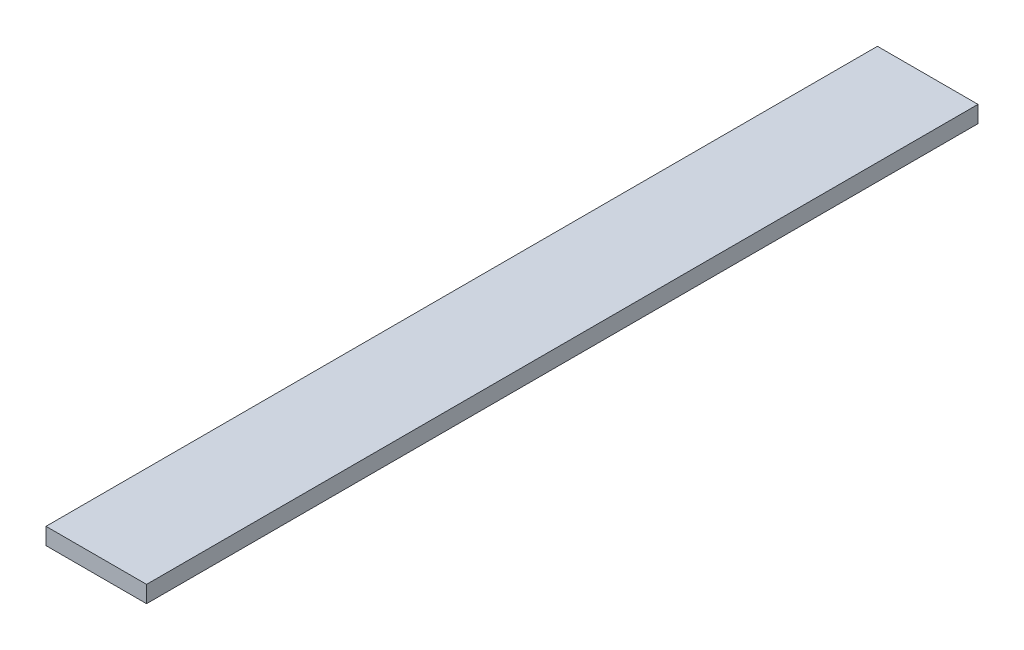
ISO-10303-21;
HEADER;
FILE_DESCRIPTION(('STEP AP214'),'2;1');
FILE_NAME('part.step','',(''),(''),'','','');
FILE_SCHEMA(('AUTOMOTIVE_DESIGN { 1 0 10303 214 1 1 1 1 }'));
ENDSEC;
DATA;
#1=APPLICATION_CONTEXT('core data for automotive mechanical design processes');
#2=APPLICATION_PROTOCOL_DEFINITION('international standard','automotive_design',2000,#1);
#3=PRODUCT_CONTEXT('',#1,'mechanical');
#4=PRODUCT('Part','Part','',(#3));
#5=PRODUCT_RELATED_PRODUCT_CATEGORY('part','',(#4));
#6=PRODUCT_DEFINITION_FORMATION('','',#4);
#7=PRODUCT_DEFINITION_CONTEXT('part definition',#1,'design');
#8=PRODUCT_DEFINITION('design','',#6,#7);
#9=PRODUCT_DEFINITION_SHAPE('','',#8);
#10=(LENGTH_UNIT() NAMED_UNIT(*) SI_UNIT(.MILLI.,.METRE.));
#11=(NAMED_UNIT(*) PLANE_ANGLE_UNIT() SI_UNIT($,.RADIAN.));
#12=(NAMED_UNIT(*) SI_UNIT($,.STERADIAN.) SOLID_ANGLE_UNIT());
#13=UNCERTAINTY_MEASURE_WITH_UNIT(LENGTH_MEASURE(1.E-05),#10,'distance_accuracy_value','');
#14=(GEOMETRIC_REPRESENTATION_CONTEXT(3) GLOBAL_UNCERTAINTY_ASSIGNED_CONTEXT((#13)) GLOBAL_UNIT_ASSIGNED_CONTEXT((#10,
#11,#12)) REPRESENTATION_CONTEXT('',''));
#15=CARTESIAN_POINT('',(0.,0.,0.));
#16=DIRECTION('',(0.,0.,1.));
#17=DIRECTION('',(1.,0.,0.));
#18=AXIS2_PLACEMENT_3D('',#15,#16,#17);
#19=CARTESIAN_POINT('',(-38.1,-6.35,630.));
#20=DIRECTION('',(1.,0.,0.));
#21=DIRECTION('',(0.,0.,-1.));
#22=AXIS2_PLACEMENT_3D('',#19,#20,#21);
#23=PLANE('',#22);
#24=DIRECTION('',(0.,-1.,0.));
#25=VECTOR('',#24,1.);
#26=CARTESIAN_POINT('',(-38.1,-6.35,0.));
#27=LINE('',#26,#25);
#28=CARTESIAN_POINT('',(-38.1,6.35,0.));
#29=VERTEX_POINT('',#28);
#30=CARTESIAN_POINT('',(-38.1,-6.35,0.));
#31=VERTEX_POINT('',#30);
#32=EDGE_CURVE('E96',#29,#31,#27,.T.);
#33=ORIENTED_EDGE('',*,*,#32,.T.);
#34=DIRECTION('',(0.,0.,-1.));
#35=VECTOR('',#34,1.);
#36=CARTESIAN_POINT('',(-38.1,-6.35,630.));
#37=LINE('',#36,#35);
#38=CARTESIAN_POINT('',(-38.1,-6.35,630.));
#39=VERTEX_POINT('',#38);
#40=EDGE_CURVE('E11',#39,#31,#37,.T.);
#41=ORIENTED_EDGE('',*,*,#40,.F.);
#42=DIRECTION('',(0.,-1.,0.));
#43=VECTOR('',#42,1.);
#44=CARTESIAN_POINT('',(-38.1,-6.35,630.));
#45=LINE('',#44,#43);
#46=CARTESIAN_POINT('',(-38.1,6.35,630.));
#47=VERTEX_POINT('',#46);
#48=EDGE_CURVE('E84',#47,#39,#45,.T.);
#49=ORIENTED_EDGE('',*,*,#48,.F.);
#50=DIRECTION('',(0.,0.,-1.));
#51=VECTOR('',#50,1.);
#52=CARTESIAN_POINT('',(-38.1,6.35,630.));
#53=LINE('',#52,#51);
#54=EDGE_CURVE('E92',#47,#29,#53,.T.);
#55=ORIENTED_EDGE('',*,*,#54,.T.);
#56=EDGE_LOOP('',(#33,#41,#49,#55));
#57=FACE_BOUND('',#56,.T.);
#58=ADVANCED_FACE('F33',(#57),#23,.F.);
#59=CARTESIAN_POINT('',(38.1,-6.35,630.));
#60=DIRECTION('',(0.,1.,0.));
#61=DIRECTION('',(0.,0.,1.));
#62=AXIS2_PLACEMENT_3D('',#59,#60,#61);
#63=PLANE('',#62);
#64=DIRECTION('',(1.,0.,0.));
#65=VECTOR('',#64,1.);
#66=CARTESIAN_POINT('',(38.1,-6.35,0.));
#67=LINE('',#66,#65);
#68=CARTESIAN_POINT('',(38.1,-6.35,0.));
#69=VERTEX_POINT('',#68);
#70=EDGE_CURVE('E88',#31,#69,#67,.T.);
#71=ORIENTED_EDGE('',*,*,#70,.T.);
#72=DIRECTION('',(0.,0.,-1.));
#73=VECTOR('',#72,1.);
#74=CARTESIAN_POINT('',(38.1,-6.35,630.));
#75=LINE('',#74,#73);
#76=CARTESIAN_POINT('',(38.1,-6.35,630.));
#77=VERTEX_POINT('',#76);
#78=EDGE_CURVE('E41',#77,#69,#75,.T.);
#79=ORIENTED_EDGE('',*,*,#78,.F.);
#80=DIRECTION('',(1.,0.,0.));
#81=VECTOR('',#80,1.);
#82=CARTESIAN_POINT('',(38.1,-6.35,630.));
#83=LINE('',#82,#81);
#84=EDGE_CURVE('E79',#39,#77,#83,.T.);
#85=ORIENTED_EDGE('',*,*,#84,.F.);
#86=ORIENTED_EDGE('',*,*,#40,.T.);
#87=EDGE_LOOP('',(#71,#79,#85,#86));
#88=FACE_BOUND('',#87,.T.);
#89=ADVANCED_FACE('F87',(#88),#63,.F.);
#90=CARTESIAN_POINT('',(38.1,-6.35,630.));
#91=DIRECTION('',(-1.,0.,0.));
#92=DIRECTION('',(0.,-1.,0.));
#93=AXIS2_PLACEMENT_3D('',#90,#91,#92);
#94=PLANE('',#93);
#95=DIRECTION('',(0.,1.,0.));
#96=VECTOR('',#95,1.);
#97=CARTESIAN_POINT('',(38.1,-6.35,0.));
#98=LINE('',#97,#96);
#99=CARTESIAN_POINT('',(38.1,6.35,0.));
#100=VERTEX_POINT('',#99);
#101=EDGE_CURVE('E66',#69,#100,#98,.T.);
#102=ORIENTED_EDGE('',*,*,#101,.T.);
#103=DIRECTION('',(0.,0.,-1.));
#104=VECTOR('',#103,1.);
#105=CARTESIAN_POINT('',(38.1,6.35,630.));
#106=LINE('',#105,#104);
#107=CARTESIAN_POINT('',(38.1,6.35,630.));
#108=VERTEX_POINT('',#107);
#109=EDGE_CURVE('E89',#108,#100,#106,.T.);
#110=ORIENTED_EDGE('',*,*,#109,.F.);
#111=DIRECTION('',(0.,1.,0.));
#112=VECTOR('',#111,1.);
#113=CARTESIAN_POINT('',(38.1,-6.35,630.));
#114=LINE('',#113,#112);
#115=EDGE_CURVE('E82',#77,#108,#114,.T.);
#116=ORIENTED_EDGE('',*,*,#115,.F.);
#117=ORIENTED_EDGE('',*,*,#78,.T.);
#118=EDGE_LOOP('',(#102,#110,#116,#117));
#119=FACE_BOUND('',#118,.T.);
#120=ADVANCED_FACE('F90',(#119),#94,.F.);
#121=CARTESIAN_POINT('',(38.1,6.35,630.));
#122=DIRECTION('',(0.,-1.,0.));
#123=DIRECTION('',(0.,0.,-1.));
#124=AXIS2_PLACEMENT_3D('',#121,#122,#123);
#125=PLANE('',#124);
#126=DIRECTION('',(-1.,0.,0.));
#127=VECTOR('',#126,1.);
#128=CARTESIAN_POINT('',(38.1,6.35,0.));
#129=LINE('',#128,#127);
#130=EDGE_CURVE('E72',#100,#29,#129,.T.);
#131=ORIENTED_EDGE('',*,*,#130,.T.);
#132=ORIENTED_EDGE('',*,*,#54,.F.);
#133=DIRECTION('',(-1.,0.,0.));
#134=VECTOR('',#133,1.);
#135=CARTESIAN_POINT('',(38.1,6.35,630.));
#136=LINE('',#135,#134);
#137=EDGE_CURVE('E49',#108,#47,#136,.T.);
#138=ORIENTED_EDGE('',*,*,#137,.F.);
#139=ORIENTED_EDGE('',*,*,#109,.T.);
#140=EDGE_LOOP('',(#131,#132,#138,#139));
#141=FACE_BOUND('',#140,.T.);
#142=ADVANCED_FACE('F103',(#141),#125,.F.);
#143=CARTESIAN_POINT('',(0.,0.,630.));
#144=DIRECTION('',(0.,0.,1.));
#145=DIRECTION('',(1.,0.,0.));
#146=AXIS2_PLACEMENT_3D('',#143,#144,#145);
#147=PLANE('',#146);
#148=ORIENTED_EDGE('',*,*,#48,.T.);
#149=ORIENTED_EDGE('',*,*,#84,.T.);
#150=ORIENTED_EDGE('',*,*,#115,.T.);
#151=ORIENTED_EDGE('',*,*,#137,.T.);
#152=EDGE_LOOP('',(#148,#149,#150,#151));
#153=FACE_BOUND('',#152,.T.);
#154=ADVANCED_FACE('F80',(#153),#147,.T.);
#155=CARTESIAN_POINT('',(0.,0.,0.));
#156=DIRECTION('',(0.,0.,1.));
#157=DIRECTION('',(1.,0.,0.));
#158=AXIS2_PLACEMENT_3D('',#155,#156,#157);
#159=PLANE('',#158);
#160=ORIENTED_EDGE('',*,*,#32,.F.);
#161=ORIENTED_EDGE('',*,*,#130,.F.);
#162=ORIENTED_EDGE('',*,*,#101,.F.);
#163=ORIENTED_EDGE('',*,*,#70,.F.);
#164=EDGE_LOOP('',(#160,#161,#162,#163));
#165=FACE_BOUND('',#164,.T.);
#166=ADVANCED_FACE('F106',(#165),#159,.F.);
#167=CLOSED_SHELL('',(#58,#89,#120,#142,#154,#166));
#168=MANIFOLD_SOLID_BREP('B2',#167);
#169=ADVANCED_BREP_SHAPE_REPRESENTATION('',(#18,#168),#14);
#170=SHAPE_DEFINITION_REPRESENTATION(#9,#169);
ENDSEC;
END-ISO-10303-21;
